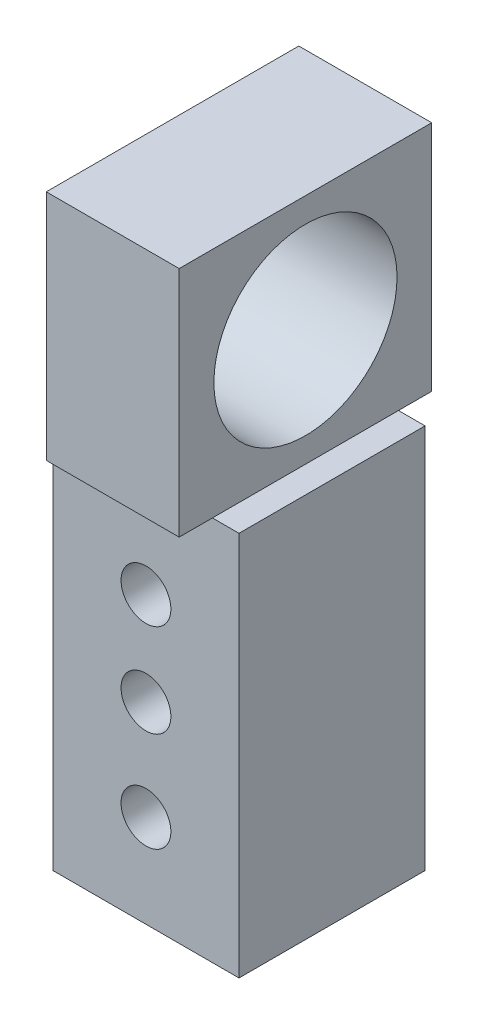
ISO-10303-21;
HEADER;
FILE_DESCRIPTION(('STEP AP214'),'2;1');
FILE_NAME('part.step','',(''),(''),'','','');
FILE_SCHEMA(('AUTOMOTIVE_DESIGN { 1 0 10303 214 1 1 1 1 }'));
ENDSEC;
DATA;
#1=APPLICATION_CONTEXT('core data for automotive mechanical design processes');
#2=APPLICATION_PROTOCOL_DEFINITION('international standard','automotive_design',2000,#1);
#3=PRODUCT_CONTEXT('',#1,'mechanical');
#4=PRODUCT('Part','Part','',(#3));
#5=PRODUCT_RELATED_PRODUCT_CATEGORY('part','',(#4));
#6=PRODUCT_DEFINITION_FORMATION('','',#4);
#7=PRODUCT_DEFINITION_CONTEXT('part definition',#1,'design');
#8=PRODUCT_DEFINITION('design','',#6,#7);
#9=PRODUCT_DEFINITION_SHAPE('','',#8);
#10=(LENGTH_UNIT() NAMED_UNIT(*) SI_UNIT(.MILLI.,.METRE.));
#11=(NAMED_UNIT(*) PLANE_ANGLE_UNIT() SI_UNIT($,.RADIAN.));
#12=(NAMED_UNIT(*) SI_UNIT($,.STERADIAN.) SOLID_ANGLE_UNIT());
#13=UNCERTAINTY_MEASURE_WITH_UNIT(LENGTH_MEASURE(1.E-05),#10,'distance_accuracy_value','');
#14=(GEOMETRIC_REPRESENTATION_CONTEXT(3) GLOBAL_UNCERTAINTY_ASSIGNED_CONTEXT((#13)) GLOBAL_UNIT_ASSIGNED_CONTEXT((#10,
#11,#12)) REPRESENTATION_CONTEXT('',''));
#15=CARTESIAN_POINT('',(0.,0.,0.));
#16=DIRECTION('',(0.,0.,1.));
#17=DIRECTION('',(1.,0.,0.));
#18=AXIS2_PLACEMENT_3D('',#15,#16,#17);
#19=CARTESIAN_POINT('',(0.,0.,0.));
#20=DIRECTION('',(0.,1.,0.));
#21=DIRECTION('',(0.,0.,1.));
#22=AXIS2_PLACEMENT_3D('',#19,#20,#21);
#23=PLANE('',#22);
#24=DIRECTION('',(0.,0.,1.));
#25=VECTOR('',#24,1.);
#26=CARTESIAN_POINT('',(-12.7,0.,-17.78));
#27=LINE('',#26,#25);
#28=CARTESIAN_POINT('',(-12.7,0.,-17.78));
#29=VERTEX_POINT('',#28);
#30=CARTESIAN_POINT('',(-12.7,0.,17.78));
#31=VERTEX_POINT('',#30);
#32=EDGE_CURVE('E171',#29,#31,#27,.T.);
#33=ORIENTED_EDGE('',*,*,#32,.F.);
#34=DIRECTION('',(-1.,0.,0.));
#35=VECTOR('',#34,1.);
#36=CARTESIAN_POINT('',(17.78,0.,-17.78));
#37=LINE('',#36,#35);
#38=CARTESIAN_POINT('',(-17.78,0.,-17.78));
#39=VERTEX_POINT('',#38);
#40=EDGE_CURVE('E84',#29,#39,#37,.T.);
#41=ORIENTED_EDGE('',*,*,#40,.T.);
#42=DIRECTION('',(0.,0.,1.));
#43=VECTOR('',#42,1.);
#44=CARTESIAN_POINT('',(-17.78,0.,17.78));
#45=LINE('',#44,#43);
#46=CARTESIAN_POINT('',(-17.78,0.,17.78));
#47=VERTEX_POINT('',#46);
#48=EDGE_CURVE('E183',#39,#47,#45,.T.);
#49=ORIENTED_EDGE('',*,*,#48,.T.);
#50=DIRECTION('',(1.,0.,0.));
#51=VECTOR('',#50,1.);
#52=CARTESIAN_POINT('',(17.78,0.,17.78));
#53=LINE('',#52,#51);
#54=EDGE_CURVE('E211',#47,#31,#53,.T.);
#55=ORIENTED_EDGE('',*,*,#54,.T.);
#56=EDGE_LOOP('',(#33,#41,#49,#55));
#57=FACE_BOUND('',#56,.T.);
#58=ADVANCED_FACE('F37',(#57),#23,.T.);
#59=CARTESIAN_POINT('',(-17.78,-73.5965,17.78));
#60=DIRECTION('',(-1.,0.,0.));
#61=DIRECTION('',(0.,0.,1.));
#62=AXIS2_PLACEMENT_3D('',#59,#60,#61);
#63=PLANE('',#62);
#64=ORIENTED_EDGE('',*,*,#48,.F.);
#65=DIRECTION('',(0.,1.,0.));
#66=VECTOR('',#65,1.);
#67=CARTESIAN_POINT('',(-17.78,-73.5965,-17.78));
#68=LINE('',#67,#66);
#69=CARTESIAN_POINT('',(-17.78,-73.5965,-17.78));
#70=VERTEX_POINT('',#69);
#71=EDGE_CURVE('E12',#70,#39,#68,.T.);
#72=ORIENTED_EDGE('',*,*,#71,.F.);
#73=DIRECTION('',(0.,0.,1.));
#74=VECTOR('',#73,1.);
#75=CARTESIAN_POINT('',(-17.78,-73.5965,17.78));
#76=LINE('',#75,#74);
#77=CARTESIAN_POINT('',(-17.78,-73.5965,17.78));
#78=VERTEX_POINT('',#77);
#79=EDGE_CURVE('E198',#70,#78,#76,.T.);
#80=ORIENTED_EDGE('',*,*,#79,.T.);
#81=DIRECTION('',(0.,1.,0.));
#82=VECTOR('',#81,1.);
#83=CARTESIAN_POINT('',(-17.78,-73.5965,17.78));
#84=LINE('',#83,#82);
#85=EDGE_CURVE('E41',#78,#47,#84,.T.);
#86=ORIENTED_EDGE('',*,*,#85,.T.);
#87=EDGE_LOOP('',(#64,#72,#80,#86));
#88=FACE_BOUND('',#87,.T.);
#89=ADVANCED_FACE('F39',(#88),#63,.T.);
#90=CARTESIAN_POINT('',(17.78,-73.5965,-17.78));
#91=DIRECTION('',(0.,0.,-1.));
#92=DIRECTION('',(-1.,0.,0.));
#93=AXIS2_PLACEMENT_3D('',#90,#91,#92);
#94=PLANE('',#93);
#95=DIRECTION('',(-1.,0.,0.));
#96=VECTOR('',#95,1.);
#97=CARTESIAN_POINT('',(12.7,0.,-17.78));
#98=LINE('',#97,#96);
#99=CARTESIAN_POINT('',(12.7,0.,-17.78));
#100=VERTEX_POINT('',#99);
#101=EDGE_CURVE('E143',#100,#29,#98,.T.);
#102=ORIENTED_EDGE('',*,*,#101,.F.);
#103=CARTESIAN_POINT('',(17.78,0.,-17.78));
#104=VERTEX_POINT('',#103);
#105=EDGE_CURVE('E201',#104,#100,#37,.T.);
#106=ORIENTED_EDGE('',*,*,#105,.F.);
#107=DIRECTION('',(0.,1.,0.));
#108=VECTOR('',#107,1.);
#109=CARTESIAN_POINT('',(17.78,-73.5965,-17.78));
#110=LINE('',#109,#108);
#111=CARTESIAN_POINT('',(17.78,-73.5965,-17.78));
#112=VERTEX_POINT('',#111);
#113=EDGE_CURVE('E46',#112,#104,#110,.T.);
#114=ORIENTED_EDGE('',*,*,#113,.F.);
#115=DIRECTION('',(-1.,0.,0.));
#116=VECTOR('',#115,1.);
#117=CARTESIAN_POINT('',(17.78,-73.5965,-17.78));
#118=LINE('',#117,#116);
#119=EDGE_CURVE('E206',#112,#70,#118,.T.);
#120=ORIENTED_EDGE('',*,*,#119,.T.);
#121=ORIENTED_EDGE('',*,*,#71,.T.);
#122=ORIENTED_EDGE('',*,*,#40,.F.);
#123=EDGE_LOOP('',(#102,#106,#114,#120,#121,#122));
#124=FACE_BOUND('',#123,.T.);
#125=CARTESIAN_POINT('',(0.,-19.05,-17.78));
#126=DIRECTION('',(0.,0.,1.));
#127=DIRECTION('',(1.,0.,0.));
#128=AXIS2_PLACEMENT_3D('',#125,#126,#127);
#129=CIRCLE('',#128,4.7625);
#130=CARTESIAN_POINT('',(4.7625,-19.05,-17.78));
#131=VERTEX_POINT('',#130);
#132=EDGE_CURVE('E180',#131,#131,#129,.T.);
#133=ORIENTED_EDGE('',*,*,#132,.T.);
#134=EDGE_LOOP('',(#133));
#135=FACE_BOUND('',#134,.T.);
#136=CARTESIAN_POINT('',(0.,-36.83,-17.78));
#137=DIRECTION('',(0.,0.,1.));
#138=DIRECTION('',(1.,0.,0.));
#139=AXIS2_PLACEMENT_3D('',#136,#137,#138);
#140=CIRCLE('',#139,4.76250000000001);
#141=CARTESIAN_POINT('',(4.76250000000001,-36.83,-17.78));
#142=VERTEX_POINT('',#141);
#143=EDGE_CURVE('E187',#142,#142,#140,.T.);
#144=ORIENTED_EDGE('',*,*,#143,.T.);
#145=EDGE_LOOP('',(#144));
#146=FACE_BOUND('',#145,.T.);
#147=CARTESIAN_POINT('',(0.,-55.88,-17.78));
#148=DIRECTION('',(0.,0.,1.));
#149=DIRECTION('',(1.,0.,0.));
#150=AXIS2_PLACEMENT_3D('',#147,#148,#149);
#151=CIRCLE('',#150,4.7625);
#152=CARTESIAN_POINT('',(4.7625,-55.88,-17.78));
#153=VERTEX_POINT('',#152);
#154=EDGE_CURVE('E193',#153,#153,#151,.T.);
#155=ORIENTED_EDGE('',*,*,#154,.T.);
#156=EDGE_LOOP('',(#155));
#157=FACE_BOUND('',#156,.T.);
#158=ADVANCED_FACE('F229',(#124,#135,#146,#157),#94,.T.);
#159=CARTESIAN_POINT('',(17.78,-73.5965,17.78));
#160=DIRECTION('',(1.,0.,0.));
#161=DIRECTION('',(0.,0.,-1.));
#162=AXIS2_PLACEMENT_3D('',#159,#160,#161);
#163=PLANE('',#162);
#164=DIRECTION('',(0.,0.,-1.));
#165=VECTOR('',#164,1.);
#166=CARTESIAN_POINT('',(17.78,0.,17.78));
#167=LINE('',#166,#165);
#168=CARTESIAN_POINT('',(17.78,0.,17.78));
#169=VERTEX_POINT('',#168);
#170=EDGE_CURVE('E213',#169,#104,#167,.T.);
#171=ORIENTED_EDGE('',*,*,#170,.F.);
#172=DIRECTION('',(0.,1.,0.));
#173=VECTOR('',#172,1.);
#174=CARTESIAN_POINT('',(17.78,-73.5965,17.78));
#175=LINE('',#174,#173);
#176=CARTESIAN_POINT('',(17.78,-73.5965,17.78));
#177=VERTEX_POINT('',#176);
#178=EDGE_CURVE('E218',#177,#169,#175,.T.);
#179=ORIENTED_EDGE('',*,*,#178,.F.);
#180=DIRECTION('',(0.,0.,-1.));
#181=VECTOR('',#180,1.);
#182=CARTESIAN_POINT('',(17.78,-73.5965,17.78));
#183=LINE('',#182,#181);
#184=EDGE_CURVE('E203',#177,#112,#183,.T.);
#185=ORIENTED_EDGE('',*,*,#184,.T.);
#186=ORIENTED_EDGE('',*,*,#113,.T.);
#187=EDGE_LOOP('',(#171,#179,#185,#186));
#188=FACE_BOUND('',#187,.T.);
#189=ADVANCED_FACE('F297',(#188),#163,.T.);
#190=CARTESIAN_POINT('',(17.78,-73.5965,17.78));
#191=DIRECTION('',(0.,0.,1.));
#192=DIRECTION('',(1.,0.,0.));
#193=AXIS2_PLACEMENT_3D('',#190,#191,#192);
#194=PLANE('',#193);
#195=DIRECTION('',(1.,0.,0.));
#196=VECTOR('',#195,1.);
#197=CARTESIAN_POINT('',(-12.7,0.,17.78));
#198=LINE('',#197,#196);
#199=CARTESIAN_POINT('',(12.7,0.,17.78));
#200=VERTEX_POINT('',#199);
#201=EDGE_CURVE('E54',#31,#200,#198,.T.);
#202=ORIENTED_EDGE('',*,*,#201,.F.);
#203=ORIENTED_EDGE('',*,*,#54,.F.);
#204=ORIENTED_EDGE('',*,*,#85,.F.);
#205=DIRECTION('',(1.,0.,0.));
#206=VECTOR('',#205,1.);
#207=CARTESIAN_POINT('',(17.78,-73.5965,17.78));
#208=LINE('',#207,#206);
#209=EDGE_CURVE('E200',#78,#177,#208,.T.);
#210=ORIENTED_EDGE('',*,*,#209,.T.);
#211=ORIENTED_EDGE('',*,*,#178,.T.);
#212=EDGE_CURVE('E210',#200,#169,#53,.T.);
#213=ORIENTED_EDGE('',*,*,#212,.F.);
#214=EDGE_LOOP('',(#202,#203,#204,#210,#211,#213));
#215=FACE_BOUND('',#214,.T.);
#216=CARTESIAN_POINT('',(0.,-19.05,17.78));
#217=DIRECTION('',(0.,0.,1.));
#218=DIRECTION('',(1.,0.,0.));
#219=AXIS2_PLACEMENT_3D('',#216,#217,#218);
#220=CIRCLE('',#219,4.7625);
#221=CARTESIAN_POINT('',(4.7625,-19.05,17.78));
#222=VERTEX_POINT('',#221);
#223=EDGE_CURVE('E184',#222,#222,#220,.T.);
#224=ORIENTED_EDGE('',*,*,#223,.F.);
#225=EDGE_LOOP('',(#224));
#226=FACE_BOUND('',#225,.T.);
#227=CARTESIAN_POINT('',(0.,-36.83,17.78));
#228=DIRECTION('',(0.,0.,1.));
#229=DIRECTION('',(1.,0.,0.));
#230=AXIS2_PLACEMENT_3D('',#227,#228,#229);
#231=CIRCLE('',#230,4.76250000000001);
#232=CARTESIAN_POINT('',(4.76250000000001,-36.83,17.78));
#233=VERTEX_POINT('',#232);
#234=EDGE_CURVE('E190',#233,#233,#231,.T.);
#235=ORIENTED_EDGE('',*,*,#234,.F.);
#236=EDGE_LOOP('',(#235));
#237=FACE_BOUND('',#236,.T.);
#238=CARTESIAN_POINT('',(0.,-55.88,17.78));
#239=DIRECTION('',(0.,0.,1.));
#240=DIRECTION('',(1.,0.,0.));
#241=AXIS2_PLACEMENT_3D('',#238,#239,#240);
#242=CIRCLE('',#241,4.7625);
#243=CARTESIAN_POINT('',(4.7625,-55.88,17.78));
#244=VERTEX_POINT('',#243);
#245=EDGE_CURVE('E176',#244,#244,#242,.T.);
#246=ORIENTED_EDGE('',*,*,#245,.F.);
#247=EDGE_LOOP('',(#246));
#248=FACE_BOUND('',#247,.T.);
#249=ADVANCED_FACE('F221',(#215,#226,#237,#248),#194,.T.);
#250=CARTESIAN_POINT('',(0.,-73.5965,0.));
#251=DIRECTION('',(0.,1.,0.));
#252=DIRECTION('',(0.,0.,1.));
#253=AXIS2_PLACEMENT_3D('',#250,#251,#252);
#254=PLANE('',#253);
#255=ORIENTED_EDGE('',*,*,#79,.F.);
#256=ORIENTED_EDGE('',*,*,#119,.F.);
#257=ORIENTED_EDGE('',*,*,#184,.F.);
#258=ORIENTED_EDGE('',*,*,#209,.F.);
#259=EDGE_LOOP('',(#255,#256,#257,#258));
#260=FACE_BOUND('',#259,.T.);
#261=ADVANCED_FACE('F234',(#260),#254,.F.);
#262=DIRECTION('',(0.,0.,-1.));
#263=VECTOR('',#262,1.);
#264=CARTESIAN_POINT('',(12.7,0.,-17.78));
#265=LINE('',#264,#263);
#266=EDGE_CURVE('E149',#200,#100,#265,.T.);
#267=ORIENTED_EDGE('',*,*,#266,.F.);
#268=ORIENTED_EDGE('',*,*,#212,.T.);
#269=ORIENTED_EDGE('',*,*,#170,.T.);
#270=ORIENTED_EDGE('',*,*,#105,.T.);
#271=EDGE_LOOP('',(#267,#268,#269,#270));
#272=FACE_BOUND('',#271,.T.);
#273=ADVANCED_FACE('F225',(#272),#23,.T.);
#274=CARTESIAN_POINT('',(0.,-55.88,-17.78));
#275=DIRECTION('',(0.,0.,1.));
#276=DIRECTION('',(1.,0.,0.));
#277=AXIS2_PLACEMENT_3D('',#274,#275,#276);
#278=CYLINDRICAL_SURFACE('',#277,4.7625);
#279=ORIENTED_EDGE('',*,*,#154,.F.);
#280=EDGE_LOOP('',(#279));
#281=FACE_BOUND('',#280,.T.);
#282=ORIENTED_EDGE('',*,*,#245,.T.);
#283=EDGE_LOOP('',(#282));
#284=FACE_BOUND('',#283,.T.);
#285=ADVANCED_FACE('F233',(#281,#284),#278,.F.);
#286=CARTESIAN_POINT('',(0.,-36.83,-17.78));
#287=DIRECTION('',(0.,0.,1.));
#288=DIRECTION('',(1.,0.,0.));
#289=AXIS2_PLACEMENT_3D('',#286,#287,#288);
#290=CYLINDRICAL_SURFACE('',#289,4.76250000000001);
#291=ORIENTED_EDGE('',*,*,#143,.F.);
#292=EDGE_LOOP('',(#291));
#293=FACE_BOUND('',#292,.T.);
#294=ORIENTED_EDGE('',*,*,#234,.T.);
#295=EDGE_LOOP('',(#294));
#296=FACE_BOUND('',#295,.T.);
#297=ADVANCED_FACE('F240',(#293,#296),#290,.F.);
#298=CARTESIAN_POINT('',(0.,-19.05,-17.78));
#299=DIRECTION('',(0.,0.,1.));
#300=DIRECTION('',(1.,0.,0.));
#301=AXIS2_PLACEMENT_3D('',#298,#299,#300);
#302=CYLINDRICAL_SURFACE('',#301,4.7625);
#303=ORIENTED_EDGE('',*,*,#132,.F.);
#304=EDGE_LOOP('',(#303));
#305=FACE_BOUND('',#304,.T.);
#306=ORIENTED_EDGE('',*,*,#223,.T.);
#307=EDGE_LOOP('',(#306));
#308=FACE_BOUND('',#307,.T.);
#309=ADVANCED_FACE('F280',(#305,#308),#302,.F.);
#310=CARTESIAN_POINT('',(-12.7,44.45,-17.78));
#311=DIRECTION('',(1.,0.,0.));
#312=DIRECTION('',(0.,0.,-1.));
#313=AXIS2_PLACEMENT_3D('',#310,#311,#312);
#314=PLANE('',#313);
#315=CARTESIAN_POINT('',(-12.7,22.225,0.));
#316=DIRECTION('',(1.,0.,0.));
#317=DIRECTION('',(0.,0.,-1.));
#318=AXIS2_PLACEMENT_3D('',#315,#316,#317);
#319=CIRCLE('',#318,17.500000052);
#320=CARTESIAN_POINT('',(-12.7,22.225,-17.500000052));
#321=VERTEX_POINT('',#320);
#322=EDGE_CURVE('E260',#321,#321,#319,.T.);
#323=ORIENTED_EDGE('',*,*,#322,.T.);
#324=EDGE_LOOP('',(#323));
#325=FACE_BOUND('',#324,.T.);
#326=ORIENTED_EDGE('',*,*,#32,.T.);
#327=DIRECTION('',(0.,0.,-1.));
#328=VECTOR('',#327,1.);
#329=CARTESIAN_POINT('',(-12.7,0.,24.13));
#330=LINE('',#329,#328);
#331=CARTESIAN_POINT('',(-12.7,0.,24.13));
#332=VERTEX_POINT('',#331);
#333=EDGE_CURVE('E168',#332,#31,#330,.T.);
#334=ORIENTED_EDGE('',*,*,#333,.F.);
#335=DIRECTION('',(0.,-1.,0.));
#336=VECTOR('',#335,1.);
#337=CARTESIAN_POINT('',(-12.7,44.45,24.13));
#338=LINE('',#337,#336);
#339=CARTESIAN_POINT('',(-12.7,44.45,24.13));
#340=VERTEX_POINT('',#339);
#341=EDGE_CURVE('E151',#340,#332,#338,.T.);
#342=ORIENTED_EDGE('',*,*,#341,.F.);
#343=DIRECTION('',(0.,0.,1.));
#344=VECTOR('',#343,1.);
#345=CARTESIAN_POINT('',(-12.7,44.45,-17.78));
#346=LINE('',#345,#344);
#347=CARTESIAN_POINT('',(-12.7,44.45,-24.13));
#348=VERTEX_POINT('',#347);
#349=EDGE_CURVE('E172',#348,#340,#346,.T.);
#350=ORIENTED_EDGE('',*,*,#349,.F.);
#351=DIRECTION('',(0.,1.,0.));
#352=VECTOR('',#351,1.);
#353=CARTESIAN_POINT('',(-12.7,44.45,-24.13));
#354=LINE('',#353,#352);
#355=CARTESIAN_POINT('',(-12.7,0.,-24.13));
#356=VERTEX_POINT('',#355);
#357=EDGE_CURVE('E134',#356,#348,#354,.T.);
#358=ORIENTED_EDGE('',*,*,#357,.F.);
#359=DIRECTION('',(0.,0.,1.));
#360=VECTOR('',#359,1.);
#361=CARTESIAN_POINT('',(-12.7,0.,-24.13));
#362=LINE('',#361,#360);
#363=EDGE_CURVE('E130',#356,#29,#362,.T.);
#364=ORIENTED_EDGE('',*,*,#363,.T.);
#365=EDGE_LOOP('',(#326,#334,#342,#350,#358,#364));
#366=FACE_BOUND('',#365,.T.);
#367=ADVANCED_FACE('F257',(#325,#366),#314,.F.);
#368=CARTESIAN_POINT('',(12.7,44.45,-17.78));
#369=DIRECTION('',(-1.,0.,0.));
#370=DIRECTION('',(0.,0.,1.));
#371=AXIS2_PLACEMENT_3D('',#368,#369,#370);
#372=PLANE('',#371);
#373=CARTESIAN_POINT('',(12.7,22.225,0.));
#374=DIRECTION('',(1.,0.,0.));
#375=DIRECTION('',(0.,0.,-1.));
#376=AXIS2_PLACEMENT_3D('',#373,#374,#375);
#377=CIRCLE('',#376,17.500000052);
#378=CARTESIAN_POINT('',(12.7,22.225,-17.500000052));
#379=VERTEX_POINT('',#378);
#380=EDGE_CURVE('E262',#379,#379,#377,.T.);
#381=ORIENTED_EDGE('',*,*,#380,.F.);
#382=EDGE_LOOP('',(#381));
#383=FACE_BOUND('',#382,.T.);
#384=ORIENTED_EDGE('',*,*,#266,.T.);
#385=DIRECTION('',(0.,0.,1.));
#386=VECTOR('',#385,1.);
#387=CARTESIAN_POINT('',(12.7,0.,-24.13));
#388=LINE('',#387,#386);
#389=CARTESIAN_POINT('',(12.7,0.,-24.13));
#390=VERTEX_POINT('',#389);
#391=EDGE_CURVE('E128',#390,#100,#388,.T.);
#392=ORIENTED_EDGE('',*,*,#391,.F.);
#393=DIRECTION('',(0.,-1.,0.));
#394=VECTOR('',#393,1.);
#395=CARTESIAN_POINT('',(12.7,44.45,-24.13));
#396=LINE('',#395,#394);
#397=CARTESIAN_POINT('',(12.7,44.45,-24.13));
#398=VERTEX_POINT('',#397);
#399=EDGE_CURVE('E135',#398,#390,#396,.T.);
#400=ORIENTED_EDGE('',*,*,#399,.F.);
#401=DIRECTION('',(0.,0.,-1.));
#402=VECTOR('',#401,1.);
#403=CARTESIAN_POINT('',(12.7,44.45,-17.78));
#404=LINE('',#403,#402);
#405=CARTESIAN_POINT('',(12.7,44.45,24.13));
#406=VERTEX_POINT('',#405);
#407=EDGE_CURVE('E174',#406,#398,#404,.T.);
#408=ORIENTED_EDGE('',*,*,#407,.F.);
#409=DIRECTION('',(0.,1.,0.));
#410=VECTOR('',#409,1.);
#411=CARTESIAN_POINT('',(12.7,44.45,24.13));
#412=LINE('',#411,#410);
#413=CARTESIAN_POINT('',(12.7,0.,24.13));
#414=VERTEX_POINT('',#413);
#415=EDGE_CURVE('E160',#414,#406,#412,.T.);
#416=ORIENTED_EDGE('',*,*,#415,.F.);
#417=DIRECTION('',(0.,0.,-1.));
#418=VECTOR('',#417,1.);
#419=CARTESIAN_POINT('',(12.7,0.,24.13));
#420=LINE('',#419,#418);
#421=EDGE_CURVE('E165',#414,#200,#420,.T.);
#422=ORIENTED_EDGE('',*,*,#421,.T.);
#423=EDGE_LOOP('',(#384,#392,#400,#408,#416,#422));
#424=FACE_BOUND('',#423,.T.);
#425=ADVANCED_FACE('F146',(#383,#424),#372,.F.);
#426=CARTESIAN_POINT('',(0.,44.45,0.));
#427=DIRECTION('',(0.,-1.,0.));
#428=DIRECTION('',(0.,0.,-1.));
#429=AXIS2_PLACEMENT_3D('',#426,#427,#428);
#430=PLANE('',#429);
#431=ORIENTED_EDGE('',*,*,#349,.T.);
#432=DIRECTION('',(-1.,0.,0.));
#433=VECTOR('',#432,1.);
#434=CARTESIAN_POINT('',(-12.7,44.45,24.13));
#435=LINE('',#434,#433);
#436=EDGE_CURVE('E163',#406,#340,#435,.T.);
#437=ORIENTED_EDGE('',*,*,#436,.F.);
#438=ORIENTED_EDGE('',*,*,#407,.T.);
#439=DIRECTION('',(1.,0.,0.));
#440=VECTOR('',#439,1.);
#441=CARTESIAN_POINT('',(12.7,44.45,-24.13));
#442=LINE('',#441,#440);
#443=EDGE_CURVE('E141',#348,#398,#442,.T.);
#444=ORIENTED_EDGE('',*,*,#443,.F.);
#445=EDGE_LOOP('',(#431,#437,#438,#444));
#446=FACE_BOUND('',#445,.T.);
#447=ADVANCED_FACE('F255',(#446),#430,.F.);
#448=CARTESIAN_POINT('',(-12.7,0.,24.13));
#449=DIRECTION('',(0.,1.,0.));
#450=DIRECTION('',(0.,0.,1.));
#451=AXIS2_PLACEMENT_3D('',#448,#449,#450);
#452=PLANE('',#451);
#453=ORIENTED_EDGE('',*,*,#201,.T.);
#454=ORIENTED_EDGE('',*,*,#421,.F.);
#455=DIRECTION('',(1.,0.,0.));
#456=VECTOR('',#455,1.);
#457=CARTESIAN_POINT('',(-12.7,0.,24.13));
#458=LINE('',#457,#456);
#459=EDGE_CURVE('E158',#332,#414,#458,.T.);
#460=ORIENTED_EDGE('',*,*,#459,.F.);
#461=ORIENTED_EDGE('',*,*,#333,.T.);
#462=EDGE_LOOP('',(#453,#454,#460,#461));
#463=FACE_BOUND('',#462,.T.);
#464=ADVANCED_FACE('F247',(#463),#452,.F.);
#465=CARTESIAN_POINT('',(0.,0.,24.13));
#466=DIRECTION('',(0.,0.,1.));
#467=DIRECTION('',(1.,0.,0.));
#468=AXIS2_PLACEMENT_3D('',#465,#466,#467);
#469=PLANE('',#468);
#470=ORIENTED_EDGE('',*,*,#341,.T.);
#471=ORIENTED_EDGE('',*,*,#459,.T.);
#472=ORIENTED_EDGE('',*,*,#415,.T.);
#473=ORIENTED_EDGE('',*,*,#436,.T.);
#474=EDGE_LOOP('',(#470,#471,#472,#473));
#475=FACE_BOUND('',#474,.T.);
#476=ADVANCED_FACE('F252',(#475),#469,.T.);
#477=CARTESIAN_POINT('',(12.7,0.,-24.13));
#478=DIRECTION('',(0.,1.,0.));
#479=DIRECTION('',(0.,0.,1.));
#480=AXIS2_PLACEMENT_3D('',#477,#478,#479);
#481=PLANE('',#480);
#482=ORIENTED_EDGE('',*,*,#101,.T.);
#483=ORIENTED_EDGE('',*,*,#363,.F.);
#484=DIRECTION('',(-1.,0.,0.));
#485=VECTOR('',#484,1.);
#486=CARTESIAN_POINT('',(12.7,0.,-24.13));
#487=LINE('',#486,#485);
#488=EDGE_CURVE('E123',#390,#356,#487,.T.);
#489=ORIENTED_EDGE('',*,*,#488,.F.);
#490=ORIENTED_EDGE('',*,*,#391,.T.);
#491=EDGE_LOOP('',(#482,#483,#489,#490));
#492=FACE_BOUND('',#491,.T.);
#493=ADVANCED_FACE('F126',(#492),#481,.F.);
#494=CARTESIAN_POINT('',(0.,0.,-24.13));
#495=DIRECTION('',(0.,0.,-1.));
#496=DIRECTION('',(-1.,0.,0.));
#497=AXIS2_PLACEMENT_3D('',#494,#495,#496);
#498=PLANE('',#497);
#499=ORIENTED_EDGE('',*,*,#399,.T.);
#500=ORIENTED_EDGE('',*,*,#488,.T.);
#501=ORIENTED_EDGE('',*,*,#357,.T.);
#502=ORIENTED_EDGE('',*,*,#443,.T.);
#503=EDGE_LOOP('',(#499,#500,#501,#502));
#504=FACE_BOUND('',#503,.T.);
#505=ADVANCED_FACE('F139',(#504),#498,.T.);
#506=CARTESIAN_POINT('',(-17.78,22.225,0.));
#507=DIRECTION('',(1.,0.,0.));
#508=DIRECTION('',(0.,0.,-1.));
#509=AXIS2_PLACEMENT_3D('',#506,#507,#508);
#510=CYLINDRICAL_SURFACE('',#509,17.500000052);
#511=ORIENTED_EDGE('',*,*,#380,.T.);
#512=EDGE_LOOP('',(#511));
#513=FACE_BOUND('',#512,.T.);
#514=ORIENTED_EDGE('',*,*,#322,.F.);
#515=EDGE_LOOP('',(#514));
#516=FACE_BOUND('',#515,.T.);
#517=ADVANCED_FACE('F270',(#513,#516),#510,.F.);
#518=CLOSED_SHELL('',(#58,#89,#158,#189,#249,#261,#273,#285,#297,#309,#367,#425,#447,#464,#476,
#493,#505,#517));
#519=MANIFOLD_SOLID_BREP('B2',#518);
#520=ADVANCED_BREP_SHAPE_REPRESENTATION('',(#18,#519),#14);
#521=SHAPE_DEFINITION_REPRESENTATION(#9,#520);
ENDSEC;
END-ISO-10303-21;
